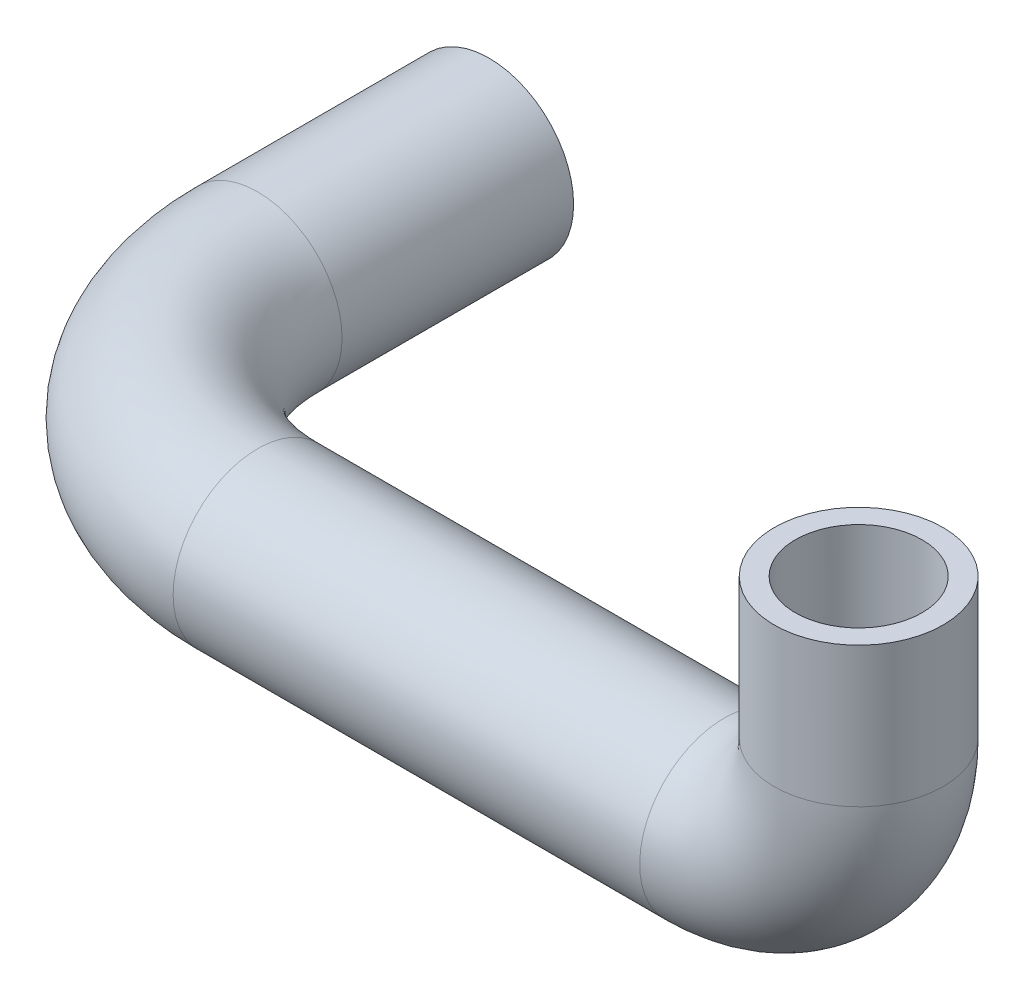
ISO-10303-21;
HEADER;
FILE_DESCRIPTION(('STEP AP214'),'2;1');
FILE_NAME('part.step','',(''),(''),'','','');
FILE_SCHEMA(('AUTOMOTIVE_DESIGN { 1 0 10303 214 1 1 1 1 }'));
ENDSEC;
DATA;
#1=APPLICATION_CONTEXT('core data for automotive mechanical design processes');
#2=APPLICATION_PROTOCOL_DEFINITION('international standard','automotive_design',2000,#1);
#3=PRODUCT_CONTEXT('',#1,'mechanical');
#4=PRODUCT('Part','Part','',(#3));
#5=PRODUCT_RELATED_PRODUCT_CATEGORY('part','',(#4));
#6=PRODUCT_DEFINITION_FORMATION('','',#4);
#7=PRODUCT_DEFINITION_CONTEXT('part definition',#1,'design');
#8=PRODUCT_DEFINITION('design','',#6,#7);
#9=PRODUCT_DEFINITION_SHAPE('','',#8);
#10=(LENGTH_UNIT() NAMED_UNIT(*) SI_UNIT(.MILLI.,.METRE.));
#11=(NAMED_UNIT(*) PLANE_ANGLE_UNIT() SI_UNIT($,.RADIAN.));
#12=(NAMED_UNIT(*) SI_UNIT($,.STERADIAN.) SOLID_ANGLE_UNIT());
#13=UNCERTAINTY_MEASURE_WITH_UNIT(LENGTH_MEASURE(1.E-05),#10,'distance_accuracy_value','');
#14=(GEOMETRIC_REPRESENTATION_CONTEXT(3) GLOBAL_UNCERTAINTY_ASSIGNED_CONTEXT((#13)) GLOBAL_UNIT_ASSIGNED_CONTEXT((#10,
#11,#12)) REPRESENTATION_CONTEXT('',''));
#15=CARTESIAN_POINT('',(0.,0.,0.));
#16=DIRECTION('',(0.,0.,1.));
#17=DIRECTION('',(1.,0.,0.));
#18=AXIS2_PLACEMENT_3D('',#15,#16,#17);
#19=CARTESIAN_POINT('',(78.,26.,43.));
#20=DIRECTION('',(0.,-1.,0.));
#21=DIRECTION('',(0.,0.,-1.));
#22=AXIS2_PLACEMENT_3D('',#19,#20,#21);
#23=PLANE('',#22);
#24=CARTESIAN_POINT('',(78.,26.,43.));
#25=DIRECTION('',(0.,-1.,0.));
#26=DIRECTION('',(0.,0.,-1.));
#27=AXIS2_PLACEMENT_3D('',#24,#25,#26);
#28=CIRCLE('',#27,6.00000000000001);
#29=CARTESIAN_POINT('',(78.,26.,37.));
#30=VERTEX_POINT('',#29);
#31=EDGE_CURVE('E108',#30,#30,#28,.T.);
#32=ORIENTED_EDGE('',*,*,#31,.T.);
#33=EDGE_LOOP('',(#32));
#34=FACE_BOUND('',#33,.T.);
#35=CARTESIAN_POINT('',(78.,26.,43.));
#36=DIRECTION('',(0.,-1.,0.));
#37=DIRECTION('',(0.,0.,-1.));
#38=AXIS2_PLACEMENT_3D('',#35,#36,#37);
#39=CIRCLE('',#38,7.99999999999999);
#40=CARTESIAN_POINT('',(78.,26.,35.));
#41=VERTEX_POINT('',#40);
#42=EDGE_CURVE('E70',#41,#41,#39,.T.);
#43=ORIENTED_EDGE('',*,*,#42,.F.);
#44=EDGE_LOOP('',(#43));
#45=FACE_BOUND('',#44,.T.);
#46=ADVANCED_FACE('F67',(#34,#45),#23,.F.);
#47=CARTESIAN_POINT('',(0.,0.,0.));
#48=DIRECTION('',(0.,0.,-1.));
#49=DIRECTION('',(1.,0.,0.));
#50=AXIS2_PLACEMENT_3D('',#47,#48,#49);
#51=PLANE('',#50);
#52=CARTESIAN_POINT('',(0.,0.,0.));
#53=DIRECTION('',(0.,0.,-1.));
#54=DIRECTION('',(0.,1.,0.));
#55=AXIS2_PLACEMENT_3D('',#52,#53,#54);
#56=CIRCLE('',#55,6.00000000000001);
#57=CARTESIAN_POINT('',(0.,5.99999999999995,0.));
#58=VERTEX_POINT('',#57);
#59=EDGE_CURVE('E101',#58,#58,#56,.T.);
#60=ORIENTED_EDGE('',*,*,#59,.F.);
#61=EDGE_LOOP('',(#60));
#62=FACE_BOUND('',#61,.T.);
#63=CARTESIAN_POINT('',(0.,0.,0.));
#64=DIRECTION('',(0.,0.,-1.));
#65=DIRECTION('',(1.,0.,0.));
#66=AXIS2_PLACEMENT_3D('',#63,#64,#65);
#67=CIRCLE('',#66,7.99999999999999);
#68=CARTESIAN_POINT('',(7.99999999999999,0.,0.));
#69=VERTEX_POINT('',#68);
#70=EDGE_CURVE('E84',#69,#69,#67,.T.);
#71=ORIENTED_EDGE('',*,*,#70,.T.);
#72=EDGE_LOOP('',(#71));
#73=FACE_BOUND('',#72,.T.);
#74=ADVANCED_FACE('F160',(#62,#73),#51,.T.);
#75=CARTESIAN_POINT('',(78.,12.74,43.));
#76=DIRECTION('',(0.,1.,0.));
#77=DIRECTION('',(0.,0.,1.));
#78=AXIS2_PLACEMENT_3D('',#75,#76,#77);
#79=CYLINDRICAL_SURFACE('',#78,7.99999999999999);
#80=ORIENTED_EDGE('',*,*,#42,.T.);
#81=EDGE_LOOP('',(#80));
#82=FACE_BOUND('',#81,.T.);
#83=CARTESIAN_POINT('',(78.,12.74,43.));
#84=DIRECTION('',(-1.0513757711482E-07,-0.999999999999994,0.));
#85=DIRECTION('',(0.,0.,-1.));
#86=AXIS2_PLACEMENT_3D('',#83,#84,#85);
#87=CIRCLE('',#86,7.99999999999999);
#88=CARTESIAN_POINT('',(86.,12.7399991588994,43.));
#89=VERTEX_POINT('',#88);
#90=EDGE_CURVE('E89',#89,#89,#87,.T.);
#91=ORIENTED_EDGE('',*,*,#90,.F.);
#92=EDGE_LOOP('',(#91));
#93=FACE_BOUND('',#92,.T.);
#94=ADVANCED_FACE('F157',(#82,#93),#79,.T.);
#95=CARTESIAN_POINT('',(21.07,0.,43.));
#96=DIRECTION('',(1.,0.,0.));
#97=DIRECTION('',(0.,0.,-1.));
#98=AXIS2_PLACEMENT_3D('',#95,#96,#97);
#99=CYLINDRICAL_SURFACE('',#98,7.99999999999999);
#100=CARTESIAN_POINT('',(65.2599986605471,0.,43.));
#101=DIRECTION('',(-1.,0.,0.));
#102=DIRECTION('',(0.,0.,-1.));
#103=AXIS2_PLACEMENT_3D('',#100,#101,#102);
#104=CIRCLE('',#103,7.99999999999999);
#105=CARTESIAN_POINT('',(65.2599986605471,-8.00000000000006,43.));
#106=VERTEX_POINT('',#105);
#107=EDGE_CURVE('E87',#106,#106,#104,.T.);
#108=ORIENTED_EDGE('',*,*,#107,.T.);
#109=EDGE_LOOP('',(#108));
#110=FACE_BOUND('',#109,.T.);
#111=CARTESIAN_POINT('',(21.07,0.,43.));
#112=DIRECTION('',(-1.,0.,1.9509702235783E-08));
#113=DIRECTION('',(-1.9509702235783E-08,0.,-1.));
#114=AXIS2_PLACEMENT_3D('',#111,#112,#113);
#115=CIRCLE('',#114,7.99999999999999);
#116=CARTESIAN_POINT('',(21.0700001560776,0.,51.));
#117=VERTEX_POINT('',#116);
#118=EDGE_CURVE('E11',#117,#117,#115,.T.);
#119=ORIENTED_EDGE('',*,*,#118,.F.);
#120=EDGE_LOOP('',(#119));
#121=FACE_BOUND('',#120,.T.);
#122=ADVANCED_FACE('F162',(#110,#121),#99,.T.);
#123=CARTESIAN_POINT('',(65.2599986605471,12.7400013394529,43.));
#124=DIRECTION('',(0.,0.,1.));
#125=DIRECTION('',(1.,0.,0.));
#126=AXIS2_PLACEMENT_3D('',#123,#124,#125);
#127=TOROIDAL_SURFACE('',#126,12.7400013394529,7.99999999999999);
#128=CARTESIAN_POINT('',(65.2599986605471,12.7400013394529,43.));
#129=DIRECTION('',(0.,0.,1.));
#130=DIRECTION('',(1.,0.,0.));
#131=AXIS2_PLACEMENT_3D('',#128,#129,#130);
#132=CIRCLE('',#131,20.7400013394529);
#133=EDGE_CURVE('',#106,#89,#132,.T.);
#134=ORIENTED_EDGE('',*,*,#107,.F.);
#135=ORIENTED_EDGE('',*,*,#90,.T.);
#136=ORIENTED_EDGE('',*,*,#133,.T.);
#137=ORIENTED_EDGE('',*,*,#133,.F.);
#138=EDGE_LOOP('',(#134,#136,#135,#137));
#139=FACE_BOUND('',#138,.T.);
#140=ADVANCED_FACE('F172',(#139),#127,.T.);
#141=CARTESIAN_POINT('',(0.,0.,0.));
#142=DIRECTION('',(0.,0.,1.));
#143=DIRECTION('',(1.,0.,0.));
#144=AXIS2_PLACEMENT_3D('',#141,#142,#143);
#145=CYLINDRICAL_SURFACE('',#144,7.99999999999999);
#146=CARTESIAN_POINT('',(0.,0.,21.9300004110694));
#147=DIRECTION('',(0.,0.,-1.));
#148=DIRECTION('',(1.,0.,0.));
#149=AXIS2_PLACEMENT_3D('',#146,#147,#148);
#150=CIRCLE('',#149,7.99999999999999);
#151=CARTESIAN_POINT('',(-7.99999999999999,0.,21.9300004110694));
#152=VERTEX_POINT('',#151);
#153=EDGE_CURVE('E73',#152,#152,#150,.T.);
#154=ORIENTED_EDGE('',*,*,#153,.T.);
#155=EDGE_LOOP('',(#154));
#156=FACE_BOUND('',#155,.T.);
#157=ORIENTED_EDGE('',*,*,#70,.F.);
#158=EDGE_LOOP('',(#157));
#159=FACE_BOUND('',#158,.T.);
#160=ADVANCED_FACE('F170',(#156,#159),#145,.T.);
#161=CARTESIAN_POINT('',(21.0699995889306,0.,21.9300004110694));
#162=DIRECTION('',(0.,1.,0.));
#163=DIRECTION('',(0.,0.,1.));
#164=AXIS2_PLACEMENT_3D('',#161,#162,#163);
#165=TOROIDAL_SURFACE('',#164,21.0699995889306,7.99999999999999);
#166=CARTESIAN_POINT('',(21.0699995889306,0.,21.9300004110694));
#167=DIRECTION('',(0.,1.,0.));
#168=DIRECTION('',(0.,0.,1.));
#169=AXIS2_PLACEMENT_3D('',#166,#167,#168);
#170=CIRCLE('',#169,29.0699995889306);
#171=EDGE_CURVE('',#152,#117,#170,.T.);
#172=ORIENTED_EDGE('',*,*,#153,.F.);
#173=ORIENTED_EDGE('',*,*,#118,.T.);
#174=ORIENTED_EDGE('',*,*,#171,.T.);
#175=ORIENTED_EDGE('',*,*,#171,.F.);
#176=EDGE_LOOP('',(#172,#174,#173,#175));
#177=FACE_BOUND('',#176,.T.);
#178=ADVANCED_FACE('F153',(#177),#165,.T.);
#179=CARTESIAN_POINT('',(0.,0.,-4.99999999999998));
#180=DIRECTION('',(0.,0.,1.));
#181=DIRECTION('',(1.,0.,0.));
#182=AXIS2_PLACEMENT_3D('',#179,#180,#181);
#183=CYLINDRICAL_SURFACE('',#182,6.00000000000001);
#184=CARTESIAN_POINT('',(0.,0.,21.9300004110694));
#185=DIRECTION('',(0.,0.,-1.));
#186=DIRECTION('',(1.,0.,0.));
#187=AXIS2_PLACEMENT_3D('',#184,#185,#186);
#188=CIRCLE('',#187,6.00000000000001);
#189=CARTESIAN_POINT('',(-6.00000000000001,0.,21.9300004110694));
#190=VERTEX_POINT('',#189);
#191=EDGE_CURVE('E104',#190,#190,#188,.T.);
#192=ORIENTED_EDGE('',*,*,#191,.F.);
#193=EDGE_LOOP('',(#192));
#194=FACE_BOUND('',#193,.T.);
#195=ORIENTED_EDGE('',*,*,#59,.T.);
#196=EDGE_LOOP('',(#195));
#197=FACE_BOUND('',#196,.T.);
#198=ADVANCED_FACE('F128',(#194,#197),#183,.F.);
#199=CARTESIAN_POINT('',(78.,12.74,43.));
#200=DIRECTION('',(0.,1.,0.));
#201=DIRECTION('',(0.,0.,1.));
#202=AXIS2_PLACEMENT_3D('',#199,#200,#201);
#203=CYLINDRICAL_SURFACE('',#202,6.00000000000001);
#204=ORIENTED_EDGE('',*,*,#31,.F.);
#205=EDGE_LOOP('',(#204));
#206=FACE_BOUND('',#205,.T.);
#207=CARTESIAN_POINT('',(78.,12.74,43.));
#208=DIRECTION('',(-1.0513757711482E-07,-0.999999999999994,0.));
#209=DIRECTION('',(0.,0.,-1.));
#210=AXIS2_PLACEMENT_3D('',#207,#208,#209);
#211=CIRCLE('',#210,6.00000000000001);
#212=CARTESIAN_POINT('',(84.,12.7399993691745,43.));
#213=VERTEX_POINT('',#212);
#214=EDGE_CURVE('E115',#213,#213,#211,.T.);
#215=ORIENTED_EDGE('',*,*,#214,.T.);
#216=EDGE_LOOP('',(#215));
#217=FACE_BOUND('',#216,.T.);
#218=ADVANCED_FACE('F127',(#206,#217),#203,.F.);
#219=CARTESIAN_POINT('',(21.07,0.,43.));
#220=DIRECTION('',(1.,0.,0.));
#221=DIRECTION('',(0.,0.,-1.));
#222=AXIS2_PLACEMENT_3D('',#219,#220,#221);
#223=CYLINDRICAL_SURFACE('',#222,6.00000000000001);
#224=CARTESIAN_POINT('',(65.2599986605471,0.,43.));
#225=DIRECTION('',(-1.,0.,0.));
#226=DIRECTION('',(0.,0.,-1.));
#227=AXIS2_PLACEMENT_3D('',#224,#225,#226);
#228=CIRCLE('',#227,6.00000000000001);
#229=CARTESIAN_POINT('',(65.2599986605471,-6.00000000000009,43.));
#230=VERTEX_POINT('',#229);
#231=EDGE_CURVE('E114',#230,#230,#228,.T.);
#232=ORIENTED_EDGE('',*,*,#231,.F.);
#233=EDGE_LOOP('',(#232));
#234=FACE_BOUND('',#233,.T.);
#235=CARTESIAN_POINT('',(21.07,0.,43.));
#236=DIRECTION('',(-1.,0.,1.9509702235783E-08));
#237=DIRECTION('',(-1.9509702235783E-08,0.,-1.));
#238=AXIS2_PLACEMENT_3D('',#235,#236,#237);
#239=CIRCLE('',#238,6.00000000000001);
#240=CARTESIAN_POINT('',(21.0700001170582,0.,49.));
#241=VERTEX_POINT('',#240);
#242=EDGE_CURVE('E102',#241,#241,#239,.T.);
#243=ORIENTED_EDGE('',*,*,#242,.T.);
#244=EDGE_LOOP('',(#243));
#245=FACE_BOUND('',#244,.T.);
#246=ADVANCED_FACE('F129',(#234,#245),#223,.F.);
#247=CARTESIAN_POINT('',(65.2599986605471,12.7400013394529,43.));
#248=DIRECTION('',(0.,0.,1.));
#249=DIRECTION('',(1.,0.,0.));
#250=AXIS2_PLACEMENT_3D('',#247,#248,#249);
#251=TOROIDAL_SURFACE('',#250,12.740001339453,6.00000000000001);
#252=CARTESIAN_POINT('',(65.2599986605471,12.7400013394529,43.));
#253=DIRECTION('',(0.,0.,1.));
#254=DIRECTION('',(1.,0.,0.));
#255=AXIS2_PLACEMENT_3D('',#252,#253,#254);
#256=CIRCLE('',#255,18.740001339453);
#257=EDGE_CURVE('',#230,#213,#256,.T.);
#258=ORIENTED_EDGE('',*,*,#231,.T.);
#259=ORIENTED_EDGE('',*,*,#214,.F.);
#260=ORIENTED_EDGE('',*,*,#257,.T.);
#261=ORIENTED_EDGE('',*,*,#257,.F.);
#262=EDGE_LOOP('',(#258,#260,#259,#261));
#263=FACE_BOUND('',#262,.T.);
#264=ADVANCED_FACE('F131',(#263),#251,.F.);
#265=CARTESIAN_POINT('',(21.0699995889306,0.,21.9300004110694));
#266=DIRECTION('',(0.,1.,0.));
#267=DIRECTION('',(0.,0.,1.));
#268=AXIS2_PLACEMENT_3D('',#265,#266,#267);
#269=TOROIDAL_SURFACE('',#268,21.0699995889306,6.00000000000001);
#270=CARTESIAN_POINT('',(21.0699995889306,0.,21.9300004110694));
#271=DIRECTION('',(0.,1.,0.));
#272=DIRECTION('',(0.,0.,1.));
#273=AXIS2_PLACEMENT_3D('',#270,#271,#272);
#274=CIRCLE('',#273,27.0699995889306);
#275=EDGE_CURVE('',#190,#241,#274,.T.);
#276=ORIENTED_EDGE('',*,*,#191,.T.);
#277=ORIENTED_EDGE('',*,*,#242,.F.);
#278=ORIENTED_EDGE('',*,*,#275,.T.);
#279=ORIENTED_EDGE('',*,*,#275,.F.);
#280=EDGE_LOOP('',(#276,#278,#277,#279));
#281=FACE_BOUND('',#280,.T.);
#282=ADVANCED_FACE('F137',(#281),#269,.F.);
#283=CLOSED_SHELL('',(#46,#74,#94,#122,#140,#160,#178,#198,#218,#246,#264,#282));
#284=MANIFOLD_SOLID_BREP('B2',#283);
#285=ADVANCED_BREP_SHAPE_REPRESENTATION('',(#18,#284),#14);
#286=SHAPE_DEFINITION_REPRESENTATION(#9,#285);
ENDSEC;
END-ISO-10303-21;
